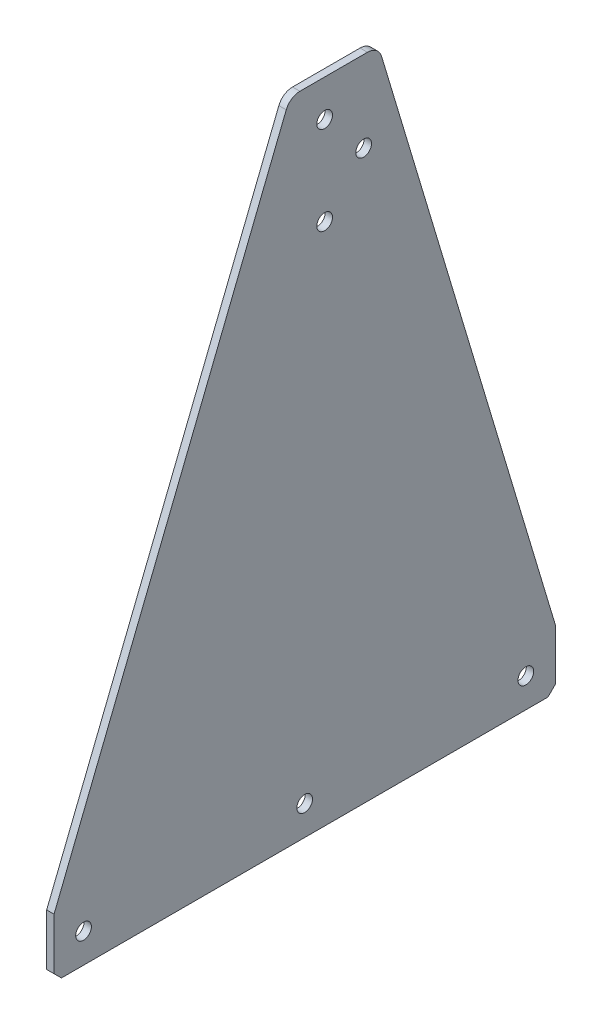
ISO-10303-21;
HEADER;
FILE_DESCRIPTION(('STEP AP214'),'2;1');
FILE_NAME('part.step','',(''),(''),'','','');
FILE_SCHEMA(('AUTOMOTIVE_DESIGN { 1 0 10303 214 1 1 1 1 }'));
ENDSEC;
DATA;
#1=APPLICATION_CONTEXT('core data for automotive mechanical design processes');
#2=APPLICATION_PROTOCOL_DEFINITION('international standard','automotive_design',2000,#1);
#3=PRODUCT_CONTEXT('',#1,'mechanical');
#4=PRODUCT('Part','Part','',(#3));
#5=PRODUCT_RELATED_PRODUCT_CATEGORY('part','',(#4));
#6=PRODUCT_DEFINITION_FORMATION('','',#4);
#7=PRODUCT_DEFINITION_CONTEXT('part definition',#1,'design');
#8=PRODUCT_DEFINITION('design','',#6,#7);
#9=PRODUCT_DEFINITION_SHAPE('','',#8);
#10=(LENGTH_UNIT() NAMED_UNIT(*) SI_UNIT(.MILLI.,.METRE.));
#11=(NAMED_UNIT(*) PLANE_ANGLE_UNIT() SI_UNIT($,.RADIAN.));
#12=(NAMED_UNIT(*) SI_UNIT($,.STERADIAN.) SOLID_ANGLE_UNIT());
#13=UNCERTAINTY_MEASURE_WITH_UNIT(LENGTH_MEASURE(1.E-05),#10,'distance_accuracy_value','');
#14=(GEOMETRIC_REPRESENTATION_CONTEXT(3) GLOBAL_UNCERTAINTY_ASSIGNED_CONTEXT((#13)) GLOBAL_UNIT_ASSIGNED_CONTEXT((#10,
#11,#12)) REPRESENTATION_CONTEXT('',''));
#15=CARTESIAN_POINT('',(0.,0.,0.));
#16=DIRECTION('',(0.,0.,1.));
#17=DIRECTION('',(1.,0.,0.));
#18=AXIS2_PLACEMENT_3D('',#15,#16,#17);
#19=CARTESIAN_POINT('',(3.175,273.05,-105.899159305061));
#20=DIRECTION('',(-1.,0.,0.));
#21=DIRECTION('',(0.,0.,1.));
#22=AXIS2_PLACEMENT_3D('',#19,#20,#21);
#23=CYLINDRICAL_SURFACE('',#22,6.35000000000001);
#24=CARTESIAN_POINT('',(0.,273.05,-105.899159305061));
#25=DIRECTION('',(1.,0.,0.));
#26=DIRECTION('',(0.,0.,1.));
#27=AXIS2_PLACEMENT_3D('',#24,#25,#26);
#28=CIRCLE('',#27,6.35000000000001);
#29=CARTESIAN_POINT('',(0.,279.4,-105.899159305061));
#30=VERTEX_POINT('',#29);
#31=CARTESIAN_POINT('',(0.,275.408330794848,-100.003332317939));
#32=VERTEX_POINT('',#31);
#33=EDGE_CURVE('E137',#30,#32,#28,.T.);
#34=ORIENTED_EDGE('',*,*,#33,.T.);
#35=DIRECTION('',(-1.,0.,0.));
#36=VECTOR('',#35,1.);
#37=CARTESIAN_POINT('',(3.175,275.408330794848,-100.003332317939));
#38=LINE('',#37,#36);
#39=CARTESIAN_POINT('',(3.175,275.408330794848,-100.003332317939));
#40=VERTEX_POINT('',#39);
#41=EDGE_CURVE('E120',#40,#32,#38,.T.);
#42=ORIENTED_EDGE('',*,*,#41,.F.);
#43=CARTESIAN_POINT('',(3.175,273.05,-105.899159305061));
#44=DIRECTION('',(1.,0.,0.));
#45=DIRECTION('',(0.,0.,1.));
#46=AXIS2_PLACEMENT_3D('',#43,#44,#45);
#47=CIRCLE('',#46,6.35000000000001);
#48=CARTESIAN_POINT('',(3.175,279.4,-105.899159305061));
#49=VERTEX_POINT('',#48);
#50=EDGE_CURVE('E125',#49,#40,#47,.T.);
#51=ORIENTED_EDGE('',*,*,#50,.F.);
#52=DIRECTION('',(-1.,0.,0.));
#53=VECTOR('',#52,1.);
#54=CARTESIAN_POINT('',(3.175,279.4,-105.899159305061));
#55=LINE('',#54,#53);
#56=EDGE_CURVE('E185',#49,#30,#55,.T.);
#57=ORIENTED_EDGE('',*,*,#56,.T.);
#58=EDGE_LOOP('',(#34,#42,#51,#57));
#59=FACE_BOUND('',#58,.T.);
#60=ADVANCED_FACE('F35',(#59),#23,.T.);
#61=CARTESIAN_POINT('',(3.175,275.408330794848,-100.003332317939));
#62=DIRECTION('',(0.,-0.371390676354104,-0.928476690885259));
#63=DIRECTION('',(0.,0.92847669088526,-0.371390676354104));
#64=AXIS2_PLACEMENT_3D('',#61,#62,#63);
#65=PLANE('',#64);
#66=DIRECTION('',(0.,-0.928476690885259,0.371390676354104));
#67=VECTOR('',#66,1.);
#68=CARTESIAN_POINT('',(0.,275.408330794848,-100.003332317939));
#69=LINE('',#68,#67);
#70=CARTESIAN_POINT('',(0.,25.4,0.));
#71=VERTEX_POINT('',#70);
#72=EDGE_CURVE('E172',#32,#71,#69,.T.);
#73=ORIENTED_EDGE('',*,*,#72,.T.);
#74=DIRECTION('',(-1.,0.,0.));
#75=VECTOR('',#74,1.);
#76=CARTESIAN_POINT('',(3.175,25.4,0.));
#77=LINE('',#76,#75);
#78=CARTESIAN_POINT('',(3.175,25.4,0.));
#79=VERTEX_POINT('',#78);
#80=EDGE_CURVE('E123',#79,#71,#77,.T.);
#81=ORIENTED_EDGE('',*,*,#80,.F.);
#82=DIRECTION('',(0.,-0.928476690885259,0.371390676354104));
#83=VECTOR('',#82,1.);
#84=CARTESIAN_POINT('',(3.175,275.408330794848,-100.003332317939));
#85=LINE('',#84,#83);
#86=EDGE_CURVE('E116',#40,#79,#85,.T.);
#87=ORIENTED_EDGE('',*,*,#86,.F.);
#88=ORIENTED_EDGE('',*,*,#41,.T.);
#89=EDGE_LOOP('',(#73,#81,#87,#88));
#90=FACE_BOUND('',#89,.T.);
#91=ADVANCED_FACE('F118',(#90),#65,.F.);
#92=CARTESIAN_POINT('',(3.175,25.4,0.));
#93=DIRECTION('',(0.,0.,-1.));
#94=DIRECTION('',(0.,1.,0.));
#95=AXIS2_PLACEMENT_3D('',#92,#93,#94);
#96=PLANE('',#95);
#97=DIRECTION('',(0.,-1.,0.));
#98=VECTOR('',#97,1.);
#99=CARTESIAN_POINT('',(0.,25.4,0.));
#100=LINE('',#99,#98);
#101=CARTESIAN_POINT('',(0.,3.17500000000006,0.));
#102=VERTEX_POINT('',#101);
#103=EDGE_CURVE('E169',#71,#102,#100,.T.);
#104=ORIENTED_EDGE('',*,*,#103,.T.);
#105=DIRECTION('',(1.,0.,0.));
#106=VECTOR('',#105,1.);
#107=CARTESIAN_POINT('',(3.175,3.17500000000006,0.));
#108=LINE('',#107,#106);
#109=CARTESIAN_POINT('',(3.175,3.17500000000006,0.));
#110=VERTEX_POINT('',#109);
#111=EDGE_CURVE('E59',#102,#110,#108,.T.);
#112=ORIENTED_EDGE('',*,*,#111,.T.);
#113=DIRECTION('',(0.,-1.,0.));
#114=VECTOR('',#113,1.);
#115=CARTESIAN_POINT('',(3.175,25.4,0.));
#116=LINE('',#115,#114);
#117=EDGE_CURVE('E124',#79,#110,#116,.T.);
#118=ORIENTED_EDGE('',*,*,#117,.F.);
#119=ORIENTED_EDGE('',*,*,#80,.T.);
#120=EDGE_LOOP('',(#104,#112,#118,#119));
#121=FACE_BOUND('',#120,.T.);
#122=ADVANCED_FACE('F171',(#121),#96,.F.);
#123=CARTESIAN_POINT('',(3.175,0.,-215.9));
#124=DIRECTION('',(0.,1.,0.));
#125=DIRECTION('',(0.,0.,1.));
#126=AXIS2_PLACEMENT_3D('',#123,#124,#125);
#127=PLANE('',#126);
#128=DIRECTION('',(0.,0.,-1.));
#129=VECTOR('',#128,1.);
#130=CARTESIAN_POINT('',(3.175,0.,-215.9));
#131=LINE('',#130,#129);
#132=CARTESIAN_POINT('',(3.175,0.,-3.17500000000004));
#133=VERTEX_POINT('',#132);
#134=CARTESIAN_POINT('',(3.175,0.,-212.725));
#135=VERTEX_POINT('',#134);
#136=EDGE_CURVE('E155',#133,#135,#131,.T.);
#137=ORIENTED_EDGE('',*,*,#136,.F.);
#138=DIRECTION('',(-1.,0.,0.));
#139=VECTOR('',#138,1.);
#140=CARTESIAN_POINT('',(3.175,0.,-3.17500000000004));
#141=LINE('',#140,#139);
#142=CARTESIAN_POINT('',(0.,0.,-3.17500000000004));
#143=VERTEX_POINT('',#142);
#144=EDGE_CURVE('E140',#133,#143,#141,.T.);
#145=ORIENTED_EDGE('',*,*,#144,.T.);
#146=DIRECTION('',(0.,0.,-1.));
#147=VECTOR('',#146,1.);
#148=CARTESIAN_POINT('',(0.,0.,-215.9));
#149=LINE('',#148,#147);
#150=CARTESIAN_POINT('',(0.,0.,-212.725));
#151=VERTEX_POINT('',#150);
#152=EDGE_CURVE('E170',#143,#151,#149,.T.);
#153=ORIENTED_EDGE('',*,*,#152,.T.);
#154=DIRECTION('',(1.,0.,0.));
#155=VECTOR('',#154,1.);
#156=CARTESIAN_POINT('',(3.175,0.,-212.725));
#157=LINE('',#156,#155);
#158=EDGE_CURVE('E138',#151,#135,#157,.T.);
#159=ORIENTED_EDGE('',*,*,#158,.T.);
#160=EDGE_LOOP('',(#137,#145,#153,#159));
#161=FACE_BOUND('',#160,.T.);
#162=ADVANCED_FACE('F159',(#161),#127,.F.);
#163=CARTESIAN_POINT('',(3.175,25.4,-215.9));
#164=DIRECTION('',(0.,0.,1.));
#165=DIRECTION('',(1.,0.,0.));
#166=AXIS2_PLACEMENT_3D('',#163,#164,#165);
#167=PLANE('',#166);
#168=DIRECTION('',(0.,1.,0.));
#169=VECTOR('',#168,1.);
#170=CARTESIAN_POINT('',(3.175,25.4,-215.9));
#171=LINE('',#170,#169);
#172=CARTESIAN_POINT('',(3.175,3.17499999999995,-215.9));
#173=VERTEX_POINT('',#172);
#174=CARTESIAN_POINT('',(3.175,25.4,-215.9));
#175=VERTEX_POINT('',#174);
#176=EDGE_CURVE('E163',#173,#175,#171,.T.);
#177=ORIENTED_EDGE('',*,*,#176,.F.);
#178=DIRECTION('',(-1.,0.,0.));
#179=VECTOR('',#178,1.);
#180=CARTESIAN_POINT('',(3.175,3.17499999999995,-215.9));
#181=LINE('',#180,#179);
#182=CARTESIAN_POINT('',(0.,3.17499999999995,-215.9));
#183=VERTEX_POINT('',#182);
#184=EDGE_CURVE('E11',#173,#183,#181,.T.);
#185=ORIENTED_EDGE('',*,*,#184,.T.);
#186=DIRECTION('',(0.,1.,0.));
#187=VECTOR('',#186,1.);
#188=CARTESIAN_POINT('',(0.,25.4,-215.9));
#189=LINE('',#188,#187);
#190=CARTESIAN_POINT('',(0.,25.4,-215.9));
#191=VERTEX_POINT('',#190);
#192=EDGE_CURVE('E174',#183,#191,#189,.T.);
#193=ORIENTED_EDGE('',*,*,#192,.T.);
#194=DIRECTION('',(-1.,0.,0.));
#195=VECTOR('',#194,1.);
#196=CARTESIAN_POINT('',(3.175,25.4,-215.9));
#197=LINE('',#196,#195);
#198=EDGE_CURVE('E142',#175,#191,#197,.T.);
#199=ORIENTED_EDGE('',*,*,#198,.F.);
#200=EDGE_LOOP('',(#177,#185,#193,#199));
#201=FACE_BOUND('',#200,.T.);
#202=ADVANCED_FACE('F241',(#201),#167,.F.);
#203=CARTESIAN_POINT('',(3.175,274.874659073346,-141.057602277996));
#204=DIRECTION('',(0.,-0.287347885566346,0.957826285221151));
#205=DIRECTION('',(0.,-0.957826285221152,-0.287347885566346));
#206=AXIS2_PLACEMENT_3D('',#203,#204,#205);
#207=PLANE('',#206);
#208=DIRECTION('',(0.,0.957826285221151,0.287347885566345));
#209=VECTOR('',#208,1.);
#210=CARTESIAN_POINT('',(0.,274.874659073346,-141.057602277996));
#211=LINE('',#210,#209);
#212=CARTESIAN_POINT('',(0.,274.874659073346,-141.057602277996));
#213=VERTEX_POINT('',#212);
#214=EDGE_CURVE('E180',#191,#213,#211,.T.);
#215=ORIENTED_EDGE('',*,*,#214,.T.);
#216=DIRECTION('',(-1.,0.,0.));
#217=VECTOR('',#216,1.);
#218=CARTESIAN_POINT('',(3.175,274.874659073346,-141.057602277996));
#219=LINE('',#218,#217);
#220=CARTESIAN_POINT('',(3.175,274.874659073346,-141.057602277996));
#221=VERTEX_POINT('',#220);
#222=EDGE_CURVE('E190',#221,#213,#219,.T.);
#223=ORIENTED_EDGE('',*,*,#222,.F.);
#224=DIRECTION('',(0.,0.957826285221151,0.287347885566345));
#225=VECTOR('',#224,1.);
#226=CARTESIAN_POINT('',(3.175,274.874659073346,-141.057602277996));
#227=LINE('',#226,#225);
#228=EDGE_CURVE('E199',#175,#221,#227,.T.);
#229=ORIENTED_EDGE('',*,*,#228,.F.);
#230=ORIENTED_EDGE('',*,*,#198,.T.);
#231=EDGE_LOOP('',(#215,#223,#229,#230));
#232=FACE_BOUND('',#231,.T.);
#233=ADVANCED_FACE('F197',(#232),#207,.F.);
#234=CARTESIAN_POINT('',(3.175,273.05,-134.975405366842));
#235=DIRECTION('',(-1.,0.,0.));
#236=DIRECTION('',(0.,0.,1.));
#237=AXIS2_PLACEMENT_3D('',#234,#235,#236);
#238=CYLINDRICAL_SURFACE('',#237,6.35);
#239=CARTESIAN_POINT('',(0.,273.05,-134.975405366842));
#240=DIRECTION('',(1.,0.,0.));
#241=DIRECTION('',(0.,0.,1.));
#242=AXIS2_PLACEMENT_3D('',#239,#240,#241);
#243=CIRCLE('',#242,6.35);
#244=CARTESIAN_POINT('',(0.,279.4,-134.975405366842));
#245=VERTEX_POINT('',#244);
#246=EDGE_CURVE('E182',#213,#245,#243,.T.);
#247=ORIENTED_EDGE('',*,*,#246,.T.);
#248=DIRECTION('',(-1.,0.,0.));
#249=VECTOR('',#248,1.);
#250=CARTESIAN_POINT('',(3.175,279.4,-134.975405366842));
#251=LINE('',#250,#249);
#252=CARTESIAN_POINT('',(3.175,279.4,-134.975405366842));
#253=VERTEX_POINT('',#252);
#254=EDGE_CURVE('E187',#253,#245,#251,.T.);
#255=ORIENTED_EDGE('',*,*,#254,.F.);
#256=CARTESIAN_POINT('',(3.175,273.05,-134.975405366842));
#257=DIRECTION('',(1.,0.,0.));
#258=DIRECTION('',(0.,0.,1.));
#259=AXIS2_PLACEMENT_3D('',#256,#257,#258);
#260=CIRCLE('',#259,6.35);
#261=EDGE_CURVE('E210',#221,#253,#260,.T.);
#262=ORIENTED_EDGE('',*,*,#261,.F.);
#263=ORIENTED_EDGE('',*,*,#222,.T.);
#264=EDGE_LOOP('',(#247,#255,#262,#263));
#265=FACE_BOUND('',#264,.T.);
#266=ADVANCED_FACE('F206',(#265),#238,.T.);
#267=CARTESIAN_POINT('',(3.175,279.4,-105.899159305061));
#268=DIRECTION('',(0.,-1.,0.));
#269=DIRECTION('',(0.,0.,-1.));
#270=AXIS2_PLACEMENT_3D('',#267,#268,#269);
#271=PLANE('',#270);
#272=DIRECTION('',(0.,0.,1.));
#273=VECTOR('',#272,1.);
#274=CARTESIAN_POINT('',(0.,279.4,-105.899159305061));
#275=LINE('',#274,#273);
#276=EDGE_CURVE('E134',#245,#30,#275,.T.);
#277=ORIENTED_EDGE('',*,*,#276,.T.);
#278=ORIENTED_EDGE('',*,*,#56,.F.);
#279=DIRECTION('',(0.,0.,1.));
#280=VECTOR('',#279,1.);
#281=CARTESIAN_POINT('',(3.175,279.4,-105.899159305061));
#282=LINE('',#281,#280);
#283=EDGE_CURVE('E130',#253,#49,#282,.T.);
#284=ORIENTED_EDGE('',*,*,#283,.F.);
#285=ORIENTED_EDGE('',*,*,#254,.T.);
#286=EDGE_LOOP('',(#277,#278,#284,#285));
#287=FACE_BOUND('',#286,.T.);
#288=ADVANCED_FACE('F209',(#287),#271,.F.);
#289=CARTESIAN_POINT('',(3.175,273.05,-105.899159305061));
#290=DIRECTION('',(-1.,0.,0.));
#291=DIRECTION('',(0.,0.,1.));
#292=AXIS2_PLACEMENT_3D('',#289,#290,#291);
#293=PLANE('',#292);
#294=CARTESIAN_POINT('',(3.175,12.7,-12.7));
#295=DIRECTION('',(1.,0.,0.));
#296=DIRECTION('',(0.,0.,-1.));
#297=AXIS2_PLACEMENT_3D('',#294,#295,#296);
#298=CIRCLE('',#297,3.3782);
#299=CARTESIAN_POINT('',(3.175,12.7,-16.0782));
#300=VERTEX_POINT('',#299);
#301=EDGE_CURVE('E307',#300,#300,#298,.T.);
#302=ORIENTED_EDGE('',*,*,#301,.F.);
#303=EDGE_LOOP('',(#302));
#304=FACE_BOUND('',#303,.T.);
#305=CARTESIAN_POINT('',(3.175,12.7,-107.95));
#306=DIRECTION('',(1.,0.,0.));
#307=DIRECTION('',(0.,0.,-1.));
#308=AXIS2_PLACEMENT_3D('',#305,#306,#307);
#309=CIRCLE('',#308,3.37819999999999);
#310=CARTESIAN_POINT('',(3.175,12.7,-111.3282));
#311=VERTEX_POINT('',#310);
#312=EDGE_CURVE('E312',#311,#311,#309,.T.);
#313=ORIENTED_EDGE('',*,*,#312,.F.);
#314=EDGE_LOOP('',(#313));
#315=FACE_BOUND('',#314,.T.);
#316=CARTESIAN_POINT('',(3.175,12.7,-203.2));
#317=DIRECTION('',(1.,0.,0.));
#318=DIRECTION('',(0.,0.,-1.));
#319=AXIS2_PLACEMENT_3D('',#316,#317,#318);
#320=CIRCLE('',#319,3.37819999999999);
#321=CARTESIAN_POINT('',(3.175,12.7,-206.5782));
#322=VERTEX_POINT('',#321);
#323=EDGE_CURVE('E224',#322,#322,#320,.T.);
#324=ORIENTED_EDGE('',*,*,#323,.F.);
#325=EDGE_LOOP('',(#324));
#326=FACE_BOUND('',#325,.T.);
#327=CARTESIAN_POINT('',(3.175,244.475,-133.35));
#328=DIRECTION('',(1.,0.,0.));
#329=DIRECTION('',(0.,0.,-1.));
#330=AXIS2_PLACEMENT_3D('',#327,#328,#329);
#331=CIRCLE('',#330,3.37819999999999);
#332=CARTESIAN_POINT('',(3.175,244.475,-136.7282));
#333=VERTEX_POINT('',#332);
#334=EDGE_CURVE('E216',#333,#333,#331,.T.);
#335=ORIENTED_EDGE('',*,*,#334,.F.);
#336=EDGE_LOOP('',(#335));
#337=FACE_BOUND('',#336,.T.);
#338=CARTESIAN_POINT('',(3.175,225.425,-116.54947917474));
#339=DIRECTION('',(1.,0.,0.));
#340=DIRECTION('',(0.,0.,-1.));
#341=AXIS2_PLACEMENT_3D('',#338,#339,#340);
#342=CIRCLE('',#341,3.37819999999999);
#343=CARTESIAN_POINT('',(3.175,225.425,-119.92767917474));
#344=VERTEX_POINT('',#343);
#345=EDGE_CURVE('E229',#344,#344,#342,.T.);
#346=ORIENTED_EDGE('',*,*,#345,.F.);
#347=EDGE_LOOP('',(#346));
#348=FACE_BOUND('',#347,.T.);
#349=CARTESIAN_POINT('',(3.175,263.525,-116.54947917474));
#350=DIRECTION('',(1.,0.,0.));
#351=DIRECTION('',(0.,0.,-1.));
#352=AXIS2_PLACEMENT_3D('',#349,#350,#351);
#353=CIRCLE('',#352,3.37819999999999);
#354=CARTESIAN_POINT('',(3.175,263.525,-119.92767917474));
#355=VERTEX_POINT('',#354);
#356=EDGE_CURVE('E235',#355,#355,#353,.T.);
#357=ORIENTED_EDGE('',*,*,#356,.F.);
#358=EDGE_LOOP('',(#357));
#359=FACE_BOUND('',#358,.T.);
#360=ORIENTED_EDGE('',*,*,#117,.T.);
#361=DIRECTION('',(0.,0.70710678118655,0.707106781186545));
#362=VECTOR('',#361,1.);
#363=CARTESIAN_POINT('',(3.175,0.,-3.17500000000004));
#364=LINE('',#363,#362);
#365=EDGE_CURVE('E44',#110,#133,#364,.F.);
#366=ORIENTED_EDGE('',*,*,#365,.T.);
#367=ORIENTED_EDGE('',*,*,#136,.T.);
#368=DIRECTION('',(0.,-0.707106781186548,0.707106781186547));
#369=VECTOR('',#368,1.);
#370=CARTESIAN_POINT('',(3.175,3.17499999999995,-215.9));
#371=LINE('',#370,#369);
#372=EDGE_CURVE('E51',#135,#173,#371,.F.);
#373=ORIENTED_EDGE('',*,*,#372,.T.);
#374=ORIENTED_EDGE('',*,*,#176,.T.);
#375=ORIENTED_EDGE('',*,*,#228,.T.);
#376=ORIENTED_EDGE('',*,*,#261,.T.);
#377=ORIENTED_EDGE('',*,*,#283,.T.);
#378=ORIENTED_EDGE('',*,*,#50,.T.);
#379=ORIENTED_EDGE('',*,*,#86,.T.);
#380=EDGE_LOOP('',(#360,#366,#367,#373,#374,#375,#376,#377,#378,#379));
#381=FACE_BOUND('',#380,.T.);
#382=ADVANCED_FACE('F128',(#304,#315,#326,#337,#348,#359,#381),#293,.F.);
#383=CARTESIAN_POINT('',(0.,273.05,-105.899159305061));
#384=DIRECTION('',(-1.,0.,0.));
#385=DIRECTION('',(0.,0.,1.));
#386=AXIS2_PLACEMENT_3D('',#383,#384,#385);
#387=PLANE('',#386);
#388=CARTESIAN_POINT('',(0.,12.7,-12.7));
#389=DIRECTION('',(1.,0.,0.));
#390=DIRECTION('',(0.,0.,-1.));
#391=AXIS2_PLACEMENT_3D('',#388,#389,#390);
#392=CIRCLE('',#391,3.3782);
#393=CARTESIAN_POINT('',(0.,12.7,-16.0782));
#394=VERTEX_POINT('',#393);
#395=EDGE_CURVE('E237',#394,#394,#392,.T.);
#396=ORIENTED_EDGE('',*,*,#395,.T.);
#397=EDGE_LOOP('',(#396));
#398=FACE_BOUND('',#397,.T.);
#399=CARTESIAN_POINT('',(0.,12.7,-107.95));
#400=DIRECTION('',(1.,0.,0.));
#401=DIRECTION('',(0.,0.,-1.));
#402=AXIS2_PLACEMENT_3D('',#399,#400,#401);
#403=CIRCLE('',#402,3.37819999999999);
#404=CARTESIAN_POINT('',(0.,12.7,-111.3282));
#405=VERTEX_POINT('',#404);
#406=EDGE_CURVE('E308',#405,#405,#403,.T.);
#407=ORIENTED_EDGE('',*,*,#406,.T.);
#408=EDGE_LOOP('',(#407));
#409=FACE_BOUND('',#408,.T.);
#410=CARTESIAN_POINT('',(0.,12.7,-203.2));
#411=DIRECTION('',(1.,0.,0.));
#412=DIRECTION('',(0.,0.,-1.));
#413=AXIS2_PLACEMENT_3D('',#410,#411,#412);
#414=CIRCLE('',#413,3.37819999999999);
#415=CARTESIAN_POINT('',(0.,12.7,-206.5782));
#416=VERTEX_POINT('',#415);
#417=EDGE_CURVE('E316',#416,#416,#414,.T.);
#418=ORIENTED_EDGE('',*,*,#417,.T.);
#419=EDGE_LOOP('',(#418));
#420=FACE_BOUND('',#419,.T.);
#421=CARTESIAN_POINT('',(0.,244.475,-133.35));
#422=DIRECTION('',(1.,0.,0.));
#423=DIRECTION('',(0.,0.,-1.));
#424=AXIS2_PLACEMENT_3D('',#421,#422,#423);
#425=CIRCLE('',#424,3.37819999999999);
#426=CARTESIAN_POINT('',(0.,244.475,-136.7282));
#427=VERTEX_POINT('',#426);
#428=EDGE_CURVE('E214',#427,#427,#425,.T.);
#429=ORIENTED_EDGE('',*,*,#428,.T.);
#430=EDGE_LOOP('',(#429));
#431=FACE_BOUND('',#430,.T.);
#432=CARTESIAN_POINT('',(0.,225.425,-116.54947917474));
#433=DIRECTION('',(1.,0.,0.));
#434=DIRECTION('',(0.,0.,-1.));
#435=AXIS2_PLACEMENT_3D('',#432,#433,#434);
#436=CIRCLE('',#435,3.37819999999999);
#437=CARTESIAN_POINT('',(0.,225.425,-119.92767917474));
#438=VERTEX_POINT('',#437);
#439=EDGE_CURVE('E221',#438,#438,#436,.T.);
#440=ORIENTED_EDGE('',*,*,#439,.T.);
#441=EDGE_LOOP('',(#440));
#442=FACE_BOUND('',#441,.T.);
#443=CARTESIAN_POINT('',(0.,263.525,-116.54947917474));
#444=DIRECTION('',(1.,0.,0.));
#445=DIRECTION('',(0.,0.,-1.));
#446=AXIS2_PLACEMENT_3D('',#443,#444,#445);
#447=CIRCLE('',#446,3.37819999999999);
#448=CARTESIAN_POINT('',(0.,263.525,-119.92767917474));
#449=VERTEX_POINT('',#448);
#450=EDGE_CURVE('E232',#449,#449,#447,.T.);
#451=ORIENTED_EDGE('',*,*,#450,.T.);
#452=EDGE_LOOP('',(#451));
#453=FACE_BOUND('',#452,.T.);
#454=ORIENTED_EDGE('',*,*,#152,.F.);
#455=DIRECTION('',(0.,-0.70710678118655,-0.707106781186545));
#456=VECTOR('',#455,1.);
#457=CARTESIAN_POINT('',(0.,85.1629203474707,81.98792034747));
#458=LINE('',#457,#456);
#459=EDGE_CURVE('E150',#143,#102,#458,.F.);
#460=ORIENTED_EDGE('',*,*,#459,.T.);
#461=ORIENTED_EDGE('',*,*,#103,.F.);
#462=ORIENTED_EDGE('',*,*,#72,.F.);
#463=ORIENTED_EDGE('',*,*,#33,.F.);
#464=ORIENTED_EDGE('',*,*,#276,.F.);
#465=ORIENTED_EDGE('',*,*,#246,.F.);
#466=ORIENTED_EDGE('',*,*,#214,.F.);
#467=ORIENTED_EDGE('',*,*,#192,.F.);
#468=DIRECTION('',(0.,0.707106781186548,-0.707106781186547));
#469=VECTOR('',#468,1.);
#470=CARTESIAN_POINT('',(0.,83.1120796525303,-295.83707965253));
#471=LINE('',#470,#469);
#472=EDGE_CURVE('E148',#183,#151,#471,.F.);
#473=ORIENTED_EDGE('',*,*,#472,.T.);
#474=EDGE_LOOP('',(#454,#460,#461,#462,#463,#464,#465,#466,#467,#473));
#475=FACE_BOUND('',#474,.T.);
#476=ADVANCED_FACE('F168',(#398,#409,#420,#431,#442,#453,#475),#387,.T.);
#477=CARTESIAN_POINT('',(0.,263.525,-116.54947917474));
#478=DIRECTION('',(1.,0.,0.));
#479=DIRECTION('',(0.,0.,-1.));
#480=AXIS2_PLACEMENT_3D('',#477,#478,#479);
#481=CYLINDRICAL_SURFACE('',#480,3.37819999999999);
#482=ORIENTED_EDGE('',*,*,#450,.F.);
#483=EDGE_LOOP('',(#482));
#484=FACE_BOUND('',#483,.T.);
#485=ORIENTED_EDGE('',*,*,#356,.T.);
#486=EDGE_LOOP('',(#485));
#487=FACE_BOUND('',#486,.T.);
#488=ADVANCED_FACE('F274',(#484,#487),#481,.F.);
#489=CARTESIAN_POINT('',(0.,225.425,-116.54947917474));
#490=DIRECTION('',(1.,0.,0.));
#491=DIRECTION('',(0.,0.,-1.));
#492=AXIS2_PLACEMENT_3D('',#489,#490,#491);
#493=CYLINDRICAL_SURFACE('',#492,3.37819999999999);
#494=ORIENTED_EDGE('',*,*,#439,.F.);
#495=EDGE_LOOP('',(#494));
#496=FACE_BOUND('',#495,.T.);
#497=ORIENTED_EDGE('',*,*,#345,.T.);
#498=EDGE_LOOP('',(#497));
#499=FACE_BOUND('',#498,.T.);
#500=ADVANCED_FACE('F281',(#496,#499),#493,.F.);
#501=CARTESIAN_POINT('',(0.,244.475,-133.35));
#502=DIRECTION('',(1.,0.,0.));
#503=DIRECTION('',(0.,0.,-1.));
#504=AXIS2_PLACEMENT_3D('',#501,#502,#503);
#505=CYLINDRICAL_SURFACE('',#504,3.37819999999999);
#506=ORIENTED_EDGE('',*,*,#428,.F.);
#507=EDGE_LOOP('',(#506));
#508=FACE_BOUND('',#507,.T.);
#509=ORIENTED_EDGE('',*,*,#334,.T.);
#510=EDGE_LOOP('',(#509));
#511=FACE_BOUND('',#510,.T.);
#512=ADVANCED_FACE('F285',(#508,#511),#505,.F.);
#513=CARTESIAN_POINT('',(0.,12.7,-203.2));
#514=DIRECTION('',(1.,0.,0.));
#515=DIRECTION('',(0.,0.,-1.));
#516=AXIS2_PLACEMENT_3D('',#513,#514,#515);
#517=CYLINDRICAL_SURFACE('',#516,3.37819999999999);
#518=ORIENTED_EDGE('',*,*,#417,.F.);
#519=EDGE_LOOP('',(#518));
#520=FACE_BOUND('',#519,.T.);
#521=ORIENTED_EDGE('',*,*,#323,.T.);
#522=EDGE_LOOP('',(#521));
#523=FACE_BOUND('',#522,.T.);
#524=ADVANCED_FACE('F289',(#520,#523),#517,.F.);
#525=CARTESIAN_POINT('',(0.,12.7,-107.95));
#526=DIRECTION('',(1.,0.,0.));
#527=DIRECTION('',(0.,0.,-1.));
#528=AXIS2_PLACEMENT_3D('',#525,#526,#527);
#529=CYLINDRICAL_SURFACE('',#528,3.37819999999999);
#530=ORIENTED_EDGE('',*,*,#406,.F.);
#531=EDGE_LOOP('',(#530));
#532=FACE_BOUND('',#531,.T.);
#533=ORIENTED_EDGE('',*,*,#312,.T.);
#534=EDGE_LOOP('',(#533));
#535=FACE_BOUND('',#534,.T.);
#536=ADVANCED_FACE('F293',(#532,#535),#529,.F.);
#537=CARTESIAN_POINT('',(0.,12.7,-12.7));
#538=DIRECTION('',(1.,0.,0.));
#539=DIRECTION('',(0.,0.,-1.));
#540=AXIS2_PLACEMENT_3D('',#537,#538,#539);
#541=CYLINDRICAL_SURFACE('',#540,3.3782);
#542=ORIENTED_EDGE('',*,*,#395,.F.);
#543=EDGE_LOOP('',(#542));
#544=FACE_BOUND('',#543,.T.);
#545=ORIENTED_EDGE('',*,*,#301,.T.);
#546=EDGE_LOOP('',(#545));
#547=FACE_BOUND('',#546,.T.);
#548=ADVANCED_FACE('F247',(#544,#547),#541,.F.);
#549=CARTESIAN_POINT('',(3.175,0.,-3.17500000000004));
#550=DIRECTION('',(0.,0.707106781186545,-0.70710678118655));
#551=DIRECTION('',(-1.,0.,0.));
#552=AXIS2_PLACEMENT_3D('',#549,#550,#551);
#553=PLANE('',#552);
#554=ORIENTED_EDGE('',*,*,#365,.F.);
#555=ORIENTED_EDGE('',*,*,#111,.F.);
#556=ORIENTED_EDGE('',*,*,#459,.F.);
#557=ORIENTED_EDGE('',*,*,#144,.F.);
#558=EDGE_LOOP('',(#554,#555,#556,#557));
#559=FACE_BOUND('',#558,.T.);
#560=ADVANCED_FACE('F165',(#559),#553,.F.);
#561=CARTESIAN_POINT('',(3.175,3.17499999999995,-215.9));
#562=DIRECTION('',(0.,0.707106781186548,0.707106781186548));
#563=DIRECTION('',(-1.,0.,0.));
#564=AXIS2_PLACEMENT_3D('',#561,#562,#563);
#565=PLANE('',#564);
#566=ORIENTED_EDGE('',*,*,#372,.F.);
#567=ORIENTED_EDGE('',*,*,#158,.F.);
#568=ORIENTED_EDGE('',*,*,#472,.F.);
#569=ORIENTED_EDGE('',*,*,#184,.F.);
#570=EDGE_LOOP('',(#566,#567,#568,#569));
#571=FACE_BOUND('',#570,.T.);
#572=ADVANCED_FACE('F38',(#571),#565,.F.);
#573=CLOSED_SHELL('',(#60,#91,#122,#162,#202,#233,#266,#288,#382,#476,#488,#500,#512,#524,#536,
#548,#560,#572));
#574=MANIFOLD_SOLID_BREP('B2',#573);
#575=ADVANCED_BREP_SHAPE_REPRESENTATION('',(#18,#574),#14);
#576=SHAPE_DEFINITION_REPRESENTATION(#9,#575);
ENDSEC;
END-ISO-10303-21;
